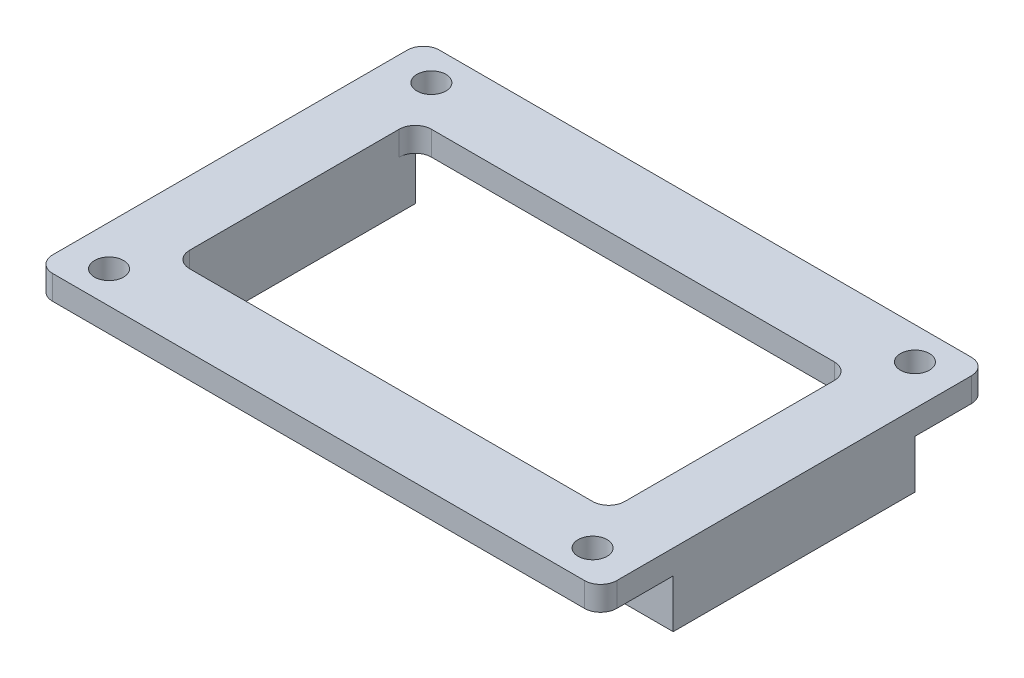
ISO-10303-21;
HEADER;
FILE_DESCRIPTION(('STEP AP214'),'2;1');
FILE_NAME('part.step','',(''),(''),'','','');
FILE_SCHEMA(('AUTOMOTIVE_DESIGN { 1 0 10303 214 1 1 1 1 }'));
ENDSEC;
DATA;
#1=APPLICATION_CONTEXT('core data for automotive mechanical design processes');
#2=APPLICATION_PROTOCOL_DEFINITION('international standard','automotive_design',2000,#1);
#3=PRODUCT_CONTEXT('',#1,'mechanical');
#4=PRODUCT('Part','Part','',(#3));
#5=PRODUCT_RELATED_PRODUCT_CATEGORY('part','',(#4));
#6=PRODUCT_DEFINITION_FORMATION('','',#4);
#7=PRODUCT_DEFINITION_CONTEXT('part definition',#1,'design');
#8=PRODUCT_DEFINITION('design','',#6,#7);
#9=PRODUCT_DEFINITION_SHAPE('','',#8);
#10=(LENGTH_UNIT() NAMED_UNIT(*) SI_UNIT(.MILLI.,.METRE.));
#11=(NAMED_UNIT(*) PLANE_ANGLE_UNIT() SI_UNIT($,.RADIAN.));
#12=(NAMED_UNIT(*) SI_UNIT($,.STERADIAN.) SOLID_ANGLE_UNIT());
#13=UNCERTAINTY_MEASURE_WITH_UNIT(LENGTH_MEASURE(1.E-05),#10,'distance_accuracy_value','');
#14=(GEOMETRIC_REPRESENTATION_CONTEXT(3) GLOBAL_UNCERTAINTY_ASSIGNED_CONTEXT((#13)) GLOBAL_UNIT_ASSIGNED_CONTEXT((#10,
#11,#12)) REPRESENTATION_CONTEXT('',''));
#15=CARTESIAN_POINT('',(0.,0.,0.));
#16=DIRECTION('',(0.,0.,1.));
#17=DIRECTION('',(1.,0.,0.));
#18=AXIS2_PLACEMENT_3D('',#15,#16,#17);
#19=CARTESIAN_POINT('',(0.,0.,0.));
#20=DIRECTION('',(0.,1.,0.));
#21=DIRECTION('',(0.,0.,1.));
#22=AXIS2_PLACEMENT_3D('',#19,#20,#21);
#23=PLANE('',#22);
#24=CARTESIAN_POINT('',(30.,0.,20.));
#25=DIRECTION('',(0.,-1.,0.));
#26=DIRECTION('',(0.,0.,-1.));
#27=AXIS2_PLACEMENT_3D('',#24,#25,#26);
#28=CIRCLE('',#27,1.8);
#29=CARTESIAN_POINT('',(30.,0.,18.2));
#30=VERTEX_POINT('',#29);
#31=EDGE_CURVE('E263',#30,#30,#28,.T.);
#32=ORIENTED_EDGE('',*,*,#31,.F.);
#33=EDGE_LOOP('',(#32));
#34=FACE_BOUND('',#33,.T.);
#35=CARTESIAN_POINT('',(-30.,0.,20.));
#36=DIRECTION('',(0.,-1.,0.));
#37=DIRECTION('',(0.,0.,-1.));
#38=AXIS2_PLACEMENT_3D('',#35,#36,#37);
#39=CIRCLE('',#38,1.8);
#40=CARTESIAN_POINT('',(-30.,0.,18.2));
#41=VERTEX_POINT('',#40);
#42=EDGE_CURVE('E240',#41,#41,#39,.T.);
#43=ORIENTED_EDGE('',*,*,#42,.F.);
#44=EDGE_LOOP('',(#43));
#45=FACE_BOUND('',#44,.T.);
#46=DIRECTION('',(0.,0.,-1.));
#47=VECTOR('',#46,1.);
#48=CARTESIAN_POINT('',(35.,0.,0.));
#49=LINE('',#48,#47);
#50=CARTESIAN_POINT('',(35.,0.,22.));
#51=VERTEX_POINT('',#50);
#52=CARTESIAN_POINT('',(35.,0.,15.));
#53=VERTEX_POINT('',#52);
#54=EDGE_CURVE('E289',#51,#53,#49,.T.);
#55=ORIENTED_EDGE('',*,*,#54,.F.);
#56=CARTESIAN_POINT('',(33.,0.,22.));
#57=DIRECTION('',(0.,1.,0.));
#58=DIRECTION('',(0.,0.,1.));
#59=AXIS2_PLACEMENT_3D('',#56,#57,#58);
#60=CIRCLE('',#59,2.);
#61=CARTESIAN_POINT('',(33.,0.,24.));
#62=VERTEX_POINT('',#61);
#63=EDGE_CURVE('E320',#51,#62,#60,.F.);
#64=ORIENTED_EDGE('',*,*,#63,.T.);
#65=DIRECTION('',(-1.,0.,0.));
#66=VECTOR('',#65,1.);
#67=CARTESIAN_POINT('',(0.,0.,24.));
#68=LINE('',#67,#66);
#69=CARTESIAN_POINT('',(-33.,0.,24.));
#70=VERTEX_POINT('',#69);
#71=EDGE_CURVE('E285',#62,#70,#68,.T.);
#72=ORIENTED_EDGE('',*,*,#71,.T.);
#73=CARTESIAN_POINT('',(-33.,0.,22.));
#74=DIRECTION('',(0.,1.,0.));
#75=DIRECTION('',(0.,0.,1.));
#76=AXIS2_PLACEMENT_3D('',#73,#74,#75);
#77=CIRCLE('',#76,2.);
#78=CARTESIAN_POINT('',(-35.,0.,22.));
#79=VERTEX_POINT('',#78);
#80=EDGE_CURVE('E318',#70,#79,#77,.F.);
#81=ORIENTED_EDGE('',*,*,#80,.T.);
#82=DIRECTION('',(0.,0.,-1.));
#83=VECTOR('',#82,1.);
#84=CARTESIAN_POINT('',(-35.,0.,0.));
#85=LINE('',#84,#83);
#86=CARTESIAN_POINT('',(-35.,0.,15.));
#87=VERTEX_POINT('',#86);
#88=EDGE_CURVE('E228',#79,#87,#85,.T.);
#89=ORIENTED_EDGE('',*,*,#88,.T.);
#90=DIRECTION('',(1.,0.,0.));
#91=VECTOR('',#90,1.);
#92=CARTESIAN_POINT('',(0.,0.,15.));
#93=LINE('',#92,#91);
#94=CARTESIAN_POINT('',(-27.,0.,15.));
#95=VERTEX_POINT('',#94);
#96=EDGE_CURVE('E225',#87,#95,#93,.T.);
#97=ORIENTED_EDGE('',*,*,#96,.T.);
#98=DIRECTION('',(0.,0.,1.));
#99=VECTOR('',#98,1.);
#100=CARTESIAN_POINT('',(-27.,0.,0.));
#101=LINE('',#100,#99);
#102=CARTESIAN_POINT('',(-27.,0.,13.));
#103=VERTEX_POINT('',#102);
#104=EDGE_CURVE('E213',#103,#95,#101,.T.);
#105=ORIENTED_EDGE('',*,*,#104,.F.);
#106=CARTESIAN_POINT('',(-25.,0.,13.));
#107=DIRECTION('',(0.,1.,0.));
#108=DIRECTION('',(0.,0.,1.));
#109=AXIS2_PLACEMENT_3D('',#106,#107,#108);
#110=CIRCLE('',#109,2.);
#111=CARTESIAN_POINT('',(-25.,0.,15.));
#112=VERTEX_POINT('',#111);
#113=EDGE_CURVE('E47',#103,#112,#110,.T.);
#114=ORIENTED_EDGE('',*,*,#113,.T.);
#115=DIRECTION('',(-1.,0.,0.));
#116=VECTOR('',#115,1.);
#117=CARTESIAN_POINT('',(-27.,0.,15.));
#118=LINE('',#117,#116);
#119=CARTESIAN_POINT('',(25.,0.,15.));
#120=VERTEX_POINT('',#119);
#121=EDGE_CURVE('E362',#120,#112,#118,.T.);
#122=ORIENTED_EDGE('',*,*,#121,.F.);
#123=CARTESIAN_POINT('',(25.,0.,13.));
#124=DIRECTION('',(0.,1.,0.));
#125=DIRECTION('',(0.,0.,1.));
#126=AXIS2_PLACEMENT_3D('',#123,#124,#125);
#127=CIRCLE('',#126,2.);
#128=CARTESIAN_POINT('',(27.,0.,13.));
#129=VERTEX_POINT('',#128);
#130=EDGE_CURVE('E349',#120,#129,#127,.T.);
#131=ORIENTED_EDGE('',*,*,#130,.T.);
#132=DIRECTION('',(0.,0.,-1.));
#133=VECTOR('',#132,1.);
#134=CARTESIAN_POINT('',(27.,0.,0.));
#135=LINE('',#134,#133);
#136=CARTESIAN_POINT('',(27.,0.,15.));
#137=VERTEX_POINT('',#136);
#138=EDGE_CURVE('E62',#137,#129,#135,.T.);
#139=ORIENTED_EDGE('',*,*,#138,.F.);
#140=DIRECTION('',(1.,0.,0.));
#141=VECTOR('',#140,1.);
#142=CARTESIAN_POINT('',(0.,0.,15.));
#143=LINE('',#142,#141);
#144=EDGE_CURVE('E417',#137,#53,#143,.T.);
#145=ORIENTED_EDGE('',*,*,#144,.T.);
#146=EDGE_LOOP('',(#55,#64,#72,#81,#89,#97,#105,#114,#122,#131,#139,#145));
#147=FACE_BOUND('',#146,.T.);
#148=ADVANCED_FACE('F39',(#34,#45,#147),#23,.F.);
#149=CARTESIAN_POINT('',(30.,0.,-20.));
#150=DIRECTION('',(0.,-1.,0.));
#151=DIRECTION('',(0.,0.,-1.));
#152=AXIS2_PLACEMENT_3D('',#149,#150,#151);
#153=CIRCLE('',#152,1.8);
#154=CARTESIAN_POINT('',(30.,0.,-21.8));
#155=VERTEX_POINT('',#154);
#156=EDGE_CURVE('E257',#155,#155,#153,.T.);
#157=ORIENTED_EDGE('',*,*,#156,.F.);
#158=EDGE_LOOP('',(#157));
#159=FACE_BOUND('',#158,.T.);
#160=CARTESIAN_POINT('',(-30.,0.,-20.));
#161=DIRECTION('',(0.,-1.,0.));
#162=DIRECTION('',(0.,0.,-1.));
#163=AXIS2_PLACEMENT_3D('',#160,#161,#162);
#164=CIRCLE('',#163,1.8);
#165=CARTESIAN_POINT('',(-30.,0.,-21.8));
#166=VERTEX_POINT('',#165);
#167=EDGE_CURVE('E251',#166,#166,#164,.T.);
#168=ORIENTED_EDGE('',*,*,#167,.F.);
#169=EDGE_LOOP('',(#168));
#170=FACE_BOUND('',#169,.T.);
#171=DIRECTION('',(-1.,0.,0.));
#172=VECTOR('',#171,1.);
#173=CARTESIAN_POINT('',(0.,0.,-24.));
#174=LINE('',#173,#172);
#175=CARTESIAN_POINT('',(33.,0.,-24.));
#176=VERTEX_POINT('',#175);
#177=CARTESIAN_POINT('',(-33.,0.,-24.));
#178=VERTEX_POINT('',#177);
#179=EDGE_CURVE('E274',#176,#178,#174,.T.);
#180=ORIENTED_EDGE('',*,*,#179,.F.);
#181=CARTESIAN_POINT('',(33.,0.,-22.));
#182=DIRECTION('',(0.,1.,0.));
#183=DIRECTION('',(0.,0.,1.));
#184=AXIS2_PLACEMENT_3D('',#181,#182,#183);
#185=CIRCLE('',#184,2.);
#186=CARTESIAN_POINT('',(35.,0.,-22.));
#187=VERTEX_POINT('',#186);
#188=EDGE_CURVE('E342',#176,#187,#185,.F.);
#189=ORIENTED_EDGE('',*,*,#188,.T.);
#190=CARTESIAN_POINT('',(35.,0.,-15.));
#191=VERTEX_POINT('',#190);
#192=EDGE_CURVE('E288',#191,#187,#49,.T.);
#193=ORIENTED_EDGE('',*,*,#192,.F.);
#194=DIRECTION('',(1.,0.,0.));
#195=VECTOR('',#194,1.);
#196=CARTESIAN_POINT('',(0.,0.,-15.));
#197=LINE('',#196,#195);
#198=CARTESIAN_POINT('',(27.,0.,-15.));
#199=VERTEX_POINT('',#198);
#200=EDGE_CURVE('E422',#199,#191,#197,.T.);
#201=ORIENTED_EDGE('',*,*,#200,.F.);
#202=DIRECTION('',(0.,0.,-1.));
#203=VECTOR('',#202,1.);
#204=CARTESIAN_POINT('',(27.,0.,0.));
#205=LINE('',#204,#203);
#206=CARTESIAN_POINT('',(27.,0.,-13.));
#207=VERTEX_POINT('',#206);
#208=EDGE_CURVE('E297',#207,#199,#205,.T.);
#209=ORIENTED_EDGE('',*,*,#208,.F.);
#210=CARTESIAN_POINT('',(25.,0.,-13.));
#211=DIRECTION('',(0.,1.,0.));
#212=DIRECTION('',(0.,0.,1.));
#213=AXIS2_PLACEMENT_3D('',#210,#211,#212);
#214=CIRCLE('',#213,2.);
#215=CARTESIAN_POINT('',(25.,0.,-15.));
#216=VERTEX_POINT('',#215);
#217=EDGE_CURVE('E353',#207,#216,#214,.T.);
#218=ORIENTED_EDGE('',*,*,#217,.T.);
#219=DIRECTION('',(1.,0.,0.));
#220=VECTOR('',#219,1.);
#221=CARTESIAN_POINT('',(-27.,0.,-15.));
#222=LINE('',#221,#220);
#223=CARTESIAN_POINT('',(-25.,0.,-15.));
#224=VERTEX_POINT('',#223);
#225=EDGE_CURVE('E371',#224,#216,#222,.T.);
#226=ORIENTED_EDGE('',*,*,#225,.F.);
#227=CARTESIAN_POINT('',(-25.,0.,-13.));
#228=DIRECTION('',(0.,1.,0.));
#229=DIRECTION('',(0.,0.,1.));
#230=AXIS2_PLACEMENT_3D('',#227,#228,#229);
#231=CIRCLE('',#230,2.);
#232=CARTESIAN_POINT('',(-27.,0.,-13.));
#233=VERTEX_POINT('',#232);
#234=EDGE_CURVE('E357',#224,#233,#231,.T.);
#235=ORIENTED_EDGE('',*,*,#234,.T.);
#236=DIRECTION('',(0.,0.,1.));
#237=VECTOR('',#236,1.);
#238=CARTESIAN_POINT('',(-27.,0.,0.));
#239=LINE('',#238,#237);
#240=CARTESIAN_POINT('',(-27.,0.,-15.));
#241=VERTEX_POINT('',#240);
#242=EDGE_CURVE('E54',#241,#233,#239,.T.);
#243=ORIENTED_EDGE('',*,*,#242,.F.);
#244=DIRECTION('',(1.,0.,0.));
#245=VECTOR('',#244,1.);
#246=CARTESIAN_POINT('',(0.,0.,-15.));
#247=LINE('',#246,#245);
#248=CARTESIAN_POINT('',(-35.,0.,-15.));
#249=VERTEX_POINT('',#248);
#250=EDGE_CURVE('E232',#249,#241,#247,.T.);
#251=ORIENTED_EDGE('',*,*,#250,.F.);
#252=CARTESIAN_POINT('',(-35.,0.,-22.));
#253=VERTEX_POINT('',#252);
#254=EDGE_CURVE('E269',#249,#253,#85,.T.);
#255=ORIENTED_EDGE('',*,*,#254,.T.);
#256=CARTESIAN_POINT('',(-33.,0.,-22.));
#257=DIRECTION('',(0.,1.,0.));
#258=DIRECTION('',(0.,0.,1.));
#259=AXIS2_PLACEMENT_3D('',#256,#257,#258);
#260=CIRCLE('',#259,2.);
#261=EDGE_CURVE('E340',#253,#178,#260,.F.);
#262=ORIENTED_EDGE('',*,*,#261,.T.);
#263=EDGE_LOOP('',(#180,#189,#193,#201,#209,#218,#226,#235,#243,#251,#255,#262));
#264=FACE_BOUND('',#263,.T.);
#265=ADVANCED_FACE('F463',(#159,#170,#264),#23,.F.);
#266=CARTESIAN_POINT('',(-35.,3.,0.));
#267=DIRECTION('',(-1.,0.,0.));
#268=DIRECTION('',(0.,0.,1.));
#269=AXIS2_PLACEMENT_3D('',#266,#267,#268);
#270=PLANE('',#269);
#271=DIRECTION('',(0.,0.,-1.));
#272=VECTOR('',#271,1.);
#273=CARTESIAN_POINT('',(-35.,3.,0.));
#274=LINE('',#273,#272);
#275=CARTESIAN_POINT('',(-35.,3.,22.));
#276=VERTEX_POINT('',#275);
#277=CARTESIAN_POINT('',(-35.,3.,-22.));
#278=VERTEX_POINT('',#277);
#279=EDGE_CURVE('E270',#276,#278,#274,.T.);
#280=ORIENTED_EDGE('',*,*,#279,.T.);
#281=DIRECTION('',(0.,-1.,0.));
#282=VECTOR('',#281,1.);
#283=CARTESIAN_POINT('',(-35.,0.,-22.));
#284=LINE('',#283,#282);
#285=EDGE_CURVE('E346',#278,#253,#284,.T.);
#286=ORIENTED_EDGE('',*,*,#285,.T.);
#287=ORIENTED_EDGE('',*,*,#254,.F.);
#288=DIRECTION('',(0.,1.,0.));
#289=VECTOR('',#288,1.);
#290=CARTESIAN_POINT('',(-35.,-6.,-15.));
#291=LINE('',#290,#289);
#292=CARTESIAN_POINT('',(-35.,-6.,-15.));
#293=VERTEX_POINT('',#292);
#294=EDGE_CURVE('E242',#293,#249,#291,.T.);
#295=ORIENTED_EDGE('',*,*,#294,.F.);
#296=DIRECTION('',(0.,0.,-1.));
#297=VECTOR('',#296,1.);
#298=CARTESIAN_POINT('',(-35.,-6.,0.));
#299=LINE('',#298,#297);
#300=CARTESIAN_POINT('',(-35.,-6.,15.));
#301=VERTEX_POINT('',#300);
#302=EDGE_CURVE('E447',#301,#293,#299,.T.);
#303=ORIENTED_EDGE('',*,*,#302,.F.);
#304=DIRECTION('',(0.,1.,0.));
#305=VECTOR('',#304,1.);
#306=CARTESIAN_POINT('',(-35.,-6.,15.));
#307=LINE('',#306,#305);
#308=EDGE_CURVE('E238',#301,#87,#307,.T.);
#309=ORIENTED_EDGE('',*,*,#308,.T.);
#310=ORIENTED_EDGE('',*,*,#88,.F.);
#311=DIRECTION('',(0.,-1.,0.));
#312=VECTOR('',#311,1.);
#313=CARTESIAN_POINT('',(-35.,3.,22.));
#314=LINE('',#313,#312);
#315=EDGE_CURVE('E344',#79,#276,#314,.F.);
#316=ORIENTED_EDGE('',*,*,#315,.T.);
#317=EDGE_LOOP('',(#280,#286,#287,#295,#303,#309,#310,#316));
#318=FACE_BOUND('',#317,.T.);
#319=ADVANCED_FACE('F459',(#318),#270,.T.);
#320=CARTESIAN_POINT('',(0.,3.,24.));
#321=DIRECTION('',(0.,0.,1.));
#322=DIRECTION('',(1.,0.,0.));
#323=AXIS2_PLACEMENT_3D('',#320,#321,#322);
#324=PLANE('',#323);
#325=ORIENTED_EDGE('',*,*,#71,.F.);
#326=DIRECTION('',(0.,-1.,0.));
#327=VECTOR('',#326,1.);
#328=CARTESIAN_POINT('',(33.,3.,24.));
#329=LINE('',#328,#327);
#330=CARTESIAN_POINT('',(33.,3.,24.));
#331=VERTEX_POINT('',#330);
#332=EDGE_CURVE('E325',#62,#331,#329,.F.);
#333=ORIENTED_EDGE('',*,*,#332,.T.);
#334=DIRECTION('',(-1.,0.,0.));
#335=VECTOR('',#334,1.);
#336=CARTESIAN_POINT('',(0.,3.,24.));
#337=LINE('',#336,#335);
#338=CARTESIAN_POINT('',(-33.,3.,24.));
#339=VERTEX_POINT('',#338);
#340=EDGE_CURVE('E273',#331,#339,#337,.T.);
#341=ORIENTED_EDGE('',*,*,#340,.T.);
#342=DIRECTION('',(0.,-1.,0.));
#343=VECTOR('',#342,1.);
#344=CARTESIAN_POINT('',(-33.,3.,24.));
#345=LINE('',#344,#343);
#346=EDGE_CURVE('E322',#339,#70,#345,.T.);
#347=ORIENTED_EDGE('',*,*,#346,.T.);
#348=EDGE_LOOP('',(#325,#333,#341,#347));
#349=FACE_BOUND('',#348,.T.);
#350=ADVANCED_FACE('F482',(#349),#324,.T.);
#351=CARTESIAN_POINT('',(35.,3.,0.));
#352=DIRECTION('',(-1.,0.,0.));
#353=DIRECTION('',(0.,0.,1.));
#354=AXIS2_PLACEMENT_3D('',#351,#352,#353);
#355=PLANE('',#354);
#356=DIRECTION('',(0.,0.,-1.));
#357=VECTOR('',#356,1.);
#358=CARTESIAN_POINT('',(35.,3.,0.));
#359=LINE('',#358,#357);
#360=CARTESIAN_POINT('',(35.,3.,22.));
#361=VERTEX_POINT('',#360);
#362=CARTESIAN_POINT('',(35.,3.,-22.));
#363=VERTEX_POINT('',#362);
#364=EDGE_CURVE('E277',#361,#363,#359,.T.);
#365=ORIENTED_EDGE('',*,*,#364,.F.);
#366=DIRECTION('',(0.,-1.,0.));
#367=VECTOR('',#366,1.);
#368=CARTESIAN_POINT('',(35.,0.,22.));
#369=LINE('',#368,#367);
#370=EDGE_CURVE('E315',#361,#51,#369,.T.);
#371=ORIENTED_EDGE('',*,*,#370,.T.);
#372=ORIENTED_EDGE('',*,*,#54,.T.);
#373=DIRECTION('',(0.,1.,0.));
#374=VECTOR('',#373,1.);
#375=CARTESIAN_POINT('',(35.,-6.,15.));
#376=LINE('',#375,#374);
#377=CARTESIAN_POINT('',(35.,-6.,15.));
#378=VERTEX_POINT('',#377);
#379=EDGE_CURVE('E429',#378,#53,#376,.T.);
#380=ORIENTED_EDGE('',*,*,#379,.F.);
#381=DIRECTION('',(0.,0.,1.));
#382=VECTOR('',#381,1.);
#383=CARTESIAN_POINT('',(35.,-6.,0.));
#384=LINE('',#383,#382);
#385=CARTESIAN_POINT('',(35.,-6.,-15.));
#386=VERTEX_POINT('',#385);
#387=EDGE_CURVE('E427',#386,#378,#384,.T.);
#388=ORIENTED_EDGE('',*,*,#387,.F.);
#389=DIRECTION('',(0.,1.,0.));
#390=VECTOR('',#389,1.);
#391=CARTESIAN_POINT('',(35.,-6.,-15.));
#392=LINE('',#391,#390);
#393=EDGE_CURVE('E435',#386,#191,#392,.T.);
#394=ORIENTED_EDGE('',*,*,#393,.T.);
#395=ORIENTED_EDGE('',*,*,#192,.T.);
#396=DIRECTION('',(0.,-1.,0.));
#397=VECTOR('',#396,1.);
#398=CARTESIAN_POINT('',(35.,3.,-22.));
#399=LINE('',#398,#397);
#400=EDGE_CURVE('E313',#187,#363,#399,.F.);
#401=ORIENTED_EDGE('',*,*,#400,.T.);
#402=EDGE_LOOP('',(#365,#371,#372,#380,#388,#394,#395,#401));
#403=FACE_BOUND('',#402,.T.);
#404=ADVANCED_FACE('F490',(#403),#355,.F.);
#405=CARTESIAN_POINT('',(0.,3.,-24.));
#406=DIRECTION('',(0.,0.,1.));
#407=DIRECTION('',(1.,0.,0.));
#408=AXIS2_PLACEMENT_3D('',#405,#406,#407);
#409=PLANE('',#408);
#410=DIRECTION('',(-1.,0.,0.));
#411=VECTOR('',#410,1.);
#412=CARTESIAN_POINT('',(0.,3.,-24.));
#413=LINE('',#412,#411);
#414=CARTESIAN_POINT('',(33.,3.,-24.));
#415=VERTEX_POINT('',#414);
#416=CARTESIAN_POINT('',(-33.,3.,-24.));
#417=VERTEX_POINT('',#416);
#418=EDGE_CURVE('E280',#415,#417,#413,.T.);
#419=ORIENTED_EDGE('',*,*,#418,.F.);
#420=DIRECTION('',(0.,-1.,0.));
#421=VECTOR('',#420,1.);
#422=CARTESIAN_POINT('',(33.,3.,-24.));
#423=LINE('',#422,#421);
#424=EDGE_CURVE('E337',#415,#176,#423,.T.);
#425=ORIENTED_EDGE('',*,*,#424,.T.);
#426=ORIENTED_EDGE('',*,*,#179,.T.);
#427=DIRECTION('',(0.,-1.,0.));
#428=VECTOR('',#427,1.);
#429=CARTESIAN_POINT('',(-33.,3.,-24.));
#430=LINE('',#429,#428);
#431=EDGE_CURVE('E335',#178,#417,#430,.F.);
#432=ORIENTED_EDGE('',*,*,#431,.T.);
#433=EDGE_LOOP('',(#419,#425,#426,#432));
#434=FACE_BOUND('',#433,.T.);
#435=ADVANCED_FACE('F468',(#434),#409,.F.);
#436=CARTESIAN_POINT('',(0.,3.,0.));
#437=DIRECTION('',(0.,1.,0.));
#438=DIRECTION('',(0.,0.,1.));
#439=AXIS2_PLACEMENT_3D('',#436,#437,#438);
#440=PLANE('',#439);
#441=DIRECTION('',(-1.,0.,0.));
#442=VECTOR('',#441,1.);
#443=CARTESIAN_POINT('',(-27.,3.,15.));
#444=LINE('',#443,#442);
#445=CARTESIAN_POINT('',(25.,3.,15.));
#446=VERTEX_POINT('',#445);
#447=CARTESIAN_POINT('',(-25.,3.,15.));
#448=VERTEX_POINT('',#447);
#449=EDGE_CURVE('E380',#446,#448,#444,.T.);
#450=ORIENTED_EDGE('',*,*,#449,.T.);
#451=CARTESIAN_POINT('',(-25.,3.,13.));
#452=DIRECTION('',(0.,1.,0.));
#453=DIRECTION('',(0.,0.,1.));
#454=AXIS2_PLACEMENT_3D('',#451,#452,#453);
#455=CIRCLE('',#454,2.);
#456=CARTESIAN_POINT('',(-27.,3.,13.));
#457=VERTEX_POINT('',#456);
#458=EDGE_CURVE('E11',#448,#457,#455,.F.);
#459=ORIENTED_EDGE('',*,*,#458,.T.);
#460=DIRECTION('',(0.,0.,-1.));
#461=VECTOR('',#460,1.);
#462=CARTESIAN_POINT('',(-27.,3.,15.));
#463=LINE('',#462,#461);
#464=CARTESIAN_POINT('',(-27.,3.,-13.));
#465=VERTEX_POINT('',#464);
#466=EDGE_CURVE('E370',#457,#465,#463,.T.);
#467=ORIENTED_EDGE('',*,*,#466,.T.);
#468=CARTESIAN_POINT('',(-25.,3.,-13.));
#469=DIRECTION('',(0.,1.,0.));
#470=DIRECTION('',(0.,0.,1.));
#471=AXIS2_PLACEMENT_3D('',#468,#469,#470);
#472=CIRCLE('',#471,2.);
#473=CARTESIAN_POINT('',(-25.,3.,-15.));
#474=VERTEX_POINT('',#473);
#475=EDGE_CURVE('E359',#465,#474,#472,.F.);
#476=ORIENTED_EDGE('',*,*,#475,.T.);
#477=DIRECTION('',(1.,0.,0.));
#478=VECTOR('',#477,1.);
#479=CARTESIAN_POINT('',(-27.,3.,-15.));
#480=LINE('',#479,#478);
#481=CARTESIAN_POINT('',(25.,3.,-15.));
#482=VERTEX_POINT('',#481);
#483=EDGE_CURVE('E382',#474,#482,#480,.T.);
#484=ORIENTED_EDGE('',*,*,#483,.T.);
#485=CARTESIAN_POINT('',(25.,3.,-13.));
#486=DIRECTION('',(0.,1.,0.));
#487=DIRECTION('',(0.,0.,1.));
#488=AXIS2_PLACEMENT_3D('',#485,#486,#487);
#489=CIRCLE('',#488,2.);
#490=CARTESIAN_POINT('',(27.,3.,-13.));
#491=VERTEX_POINT('',#490);
#492=EDGE_CURVE('E355',#482,#491,#489,.F.);
#493=ORIENTED_EDGE('',*,*,#492,.T.);
#494=DIRECTION('',(0.,0.,1.));
#495=VECTOR('',#494,1.);
#496=CARTESIAN_POINT('',(27.,3.,15.));
#497=LINE('',#496,#495);
#498=CARTESIAN_POINT('',(27.,3.,13.));
#499=VERTEX_POINT('',#498);
#500=EDGE_CURVE('E385',#491,#499,#497,.T.);
#501=ORIENTED_EDGE('',*,*,#500,.T.);
#502=CARTESIAN_POINT('',(25.,3.,13.));
#503=DIRECTION('',(0.,1.,0.));
#504=DIRECTION('',(0.,0.,1.));
#505=AXIS2_PLACEMENT_3D('',#502,#503,#504);
#506=CIRCLE('',#505,2.);
#507=EDGE_CURVE('E351',#499,#446,#506,.F.);
#508=ORIENTED_EDGE('',*,*,#507,.T.);
#509=EDGE_LOOP('',(#450,#459,#467,#476,#484,#493,#501,#508));
#510=FACE_BOUND('',#509,.T.);
#511=CARTESIAN_POINT('',(-30.,3.,20.));
#512=DIRECTION('',(0.,1.,0.));
#513=DIRECTION('',(0.,0.,1.));
#514=AXIS2_PLACEMENT_3D('',#511,#512,#513);
#515=CIRCLE('',#514,1.8);
#516=CARTESIAN_POINT('',(-30.,3.,21.8));
#517=VERTEX_POINT('',#516);
#518=EDGE_CURVE('E248',#517,#517,#515,.T.);
#519=ORIENTED_EDGE('',*,*,#518,.F.);
#520=EDGE_LOOP('',(#519));
#521=FACE_BOUND('',#520,.T.);
#522=CARTESIAN_POINT('',(-30.,3.,-20.));
#523=DIRECTION('',(0.,1.,0.));
#524=DIRECTION('',(0.,0.,1.));
#525=AXIS2_PLACEMENT_3D('',#522,#523,#524);
#526=CIRCLE('',#525,1.8);
#527=CARTESIAN_POINT('',(-30.,3.,-18.2));
#528=VERTEX_POINT('',#527);
#529=EDGE_CURVE('E254',#528,#528,#526,.T.);
#530=ORIENTED_EDGE('',*,*,#529,.F.);
#531=EDGE_LOOP('',(#530));
#532=FACE_BOUND('',#531,.T.);
#533=CARTESIAN_POINT('',(30.,3.,-20.));
#534=DIRECTION('',(0.,1.,0.));
#535=DIRECTION('',(0.,0.,1.));
#536=AXIS2_PLACEMENT_3D('',#533,#534,#535);
#537=CIRCLE('',#536,1.8);
#538=CARTESIAN_POINT('',(30.,3.,-18.2));
#539=VERTEX_POINT('',#538);
#540=EDGE_CURVE('E260',#539,#539,#537,.T.);
#541=ORIENTED_EDGE('',*,*,#540,.F.);
#542=EDGE_LOOP('',(#541));
#543=FACE_BOUND('',#542,.T.);
#544=CARTESIAN_POINT('',(30.,3.,20.));
#545=DIRECTION('',(0.,1.,0.));
#546=DIRECTION('',(0.,0.,1.));
#547=AXIS2_PLACEMENT_3D('',#544,#545,#546);
#548=CIRCLE('',#547,1.8);
#549=CARTESIAN_POINT('',(30.,3.,21.8));
#550=VERTEX_POINT('',#549);
#551=EDGE_CURVE('E266',#550,#550,#548,.T.);
#552=ORIENTED_EDGE('',*,*,#551,.F.);
#553=EDGE_LOOP('',(#552));
#554=FACE_BOUND('',#553,.T.);
#555=ORIENTED_EDGE('',*,*,#340,.F.);
#556=CARTESIAN_POINT('',(33.,3.,22.));
#557=DIRECTION('',(0.,1.,0.));
#558=DIRECTION('',(0.,0.,1.));
#559=AXIS2_PLACEMENT_3D('',#556,#557,#558);
#560=CIRCLE('',#559,2.);
#561=EDGE_CURVE('E333',#331,#361,#560,.T.);
#562=ORIENTED_EDGE('',*,*,#561,.T.);
#563=ORIENTED_EDGE('',*,*,#364,.T.);
#564=CARTESIAN_POINT('',(33.,3.,-22.));
#565=DIRECTION('',(0.,1.,0.));
#566=DIRECTION('',(0.,0.,1.));
#567=AXIS2_PLACEMENT_3D('',#564,#565,#566);
#568=CIRCLE('',#567,2.);
#569=EDGE_CURVE('E331',#363,#415,#568,.T.);
#570=ORIENTED_EDGE('',*,*,#569,.T.);
#571=ORIENTED_EDGE('',*,*,#418,.T.);
#572=CARTESIAN_POINT('',(-33.,3.,-22.));
#573=DIRECTION('',(0.,1.,0.));
#574=DIRECTION('',(0.,0.,1.));
#575=AXIS2_PLACEMENT_3D('',#572,#573,#574);
#576=CIRCLE('',#575,2.);
#577=EDGE_CURVE('E329',#417,#278,#576,.T.);
#578=ORIENTED_EDGE('',*,*,#577,.T.);
#579=ORIENTED_EDGE('',*,*,#279,.F.);
#580=CARTESIAN_POINT('',(-33.,3.,22.));
#581=DIRECTION('',(0.,1.,0.));
#582=DIRECTION('',(0.,0.,1.));
#583=AXIS2_PLACEMENT_3D('',#580,#581,#582);
#584=CIRCLE('',#583,2.);
#585=EDGE_CURVE('E327',#276,#339,#584,.T.);
#586=ORIENTED_EDGE('',*,*,#585,.T.);
#587=EDGE_LOOP('',(#555,#562,#563,#570,#571,#578,#579,#586));
#588=FACE_BOUND('',#587,.T.);
#589=ADVANCED_FACE('F377',(#510,#521,#532,#543,#554,#588),#440,.T.);
#590=CARTESIAN_POINT('',(30.,0.,20.));
#591=DIRECTION('',(0.,-1.,0.));
#592=DIRECTION('',(0.,0.,-1.));
#593=AXIS2_PLACEMENT_3D('',#590,#591,#592);
#594=CYLINDRICAL_SURFACE('',#593,1.8);
#595=ORIENTED_EDGE('',*,*,#551,.T.);
#596=EDGE_LOOP('',(#595));
#597=FACE_BOUND('',#596,.T.);
#598=ORIENTED_EDGE('',*,*,#31,.T.);
#599=EDGE_LOOP('',(#598));
#600=FACE_BOUND('',#599,.T.);
#601=ADVANCED_FACE('F821',(#597,#600),#594,.F.);
#602=CARTESIAN_POINT('',(30.,0.,-20.));
#603=DIRECTION('',(0.,-1.,0.));
#604=DIRECTION('',(0.,0.,-1.));
#605=AXIS2_PLACEMENT_3D('',#602,#603,#604);
#606=CYLINDRICAL_SURFACE('',#605,1.8);
#607=ORIENTED_EDGE('',*,*,#540,.T.);
#608=EDGE_LOOP('',(#607));
#609=FACE_BOUND('',#608,.T.);
#610=ORIENTED_EDGE('',*,*,#156,.T.);
#611=EDGE_LOOP('',(#610));
#612=FACE_BOUND('',#611,.T.);
#613=ADVANCED_FACE('F811',(#609,#612),#606,.F.);
#614=CARTESIAN_POINT('',(-30.,0.,-20.));
#615=DIRECTION('',(0.,-1.,0.));
#616=DIRECTION('',(0.,0.,-1.));
#617=AXIS2_PLACEMENT_3D('',#614,#615,#616);
#618=CYLINDRICAL_SURFACE('',#617,1.8);
#619=ORIENTED_EDGE('',*,*,#529,.T.);
#620=EDGE_LOOP('',(#619));
#621=FACE_BOUND('',#620,.T.);
#622=ORIENTED_EDGE('',*,*,#167,.T.);
#623=EDGE_LOOP('',(#622));
#624=FACE_BOUND('',#623,.T.);
#625=ADVANCED_FACE('F801',(#621,#624),#618,.F.);
#626=CARTESIAN_POINT('',(-30.,0.,20.));
#627=DIRECTION('',(0.,-1.,0.));
#628=DIRECTION('',(0.,0.,-1.));
#629=AXIS2_PLACEMENT_3D('',#626,#627,#628);
#630=CYLINDRICAL_SURFACE('',#629,1.8);
#631=ORIENTED_EDGE('',*,*,#518,.T.);
#632=EDGE_LOOP('',(#631));
#633=FACE_BOUND('',#632,.T.);
#634=ORIENTED_EDGE('',*,*,#42,.T.);
#635=EDGE_LOOP('',(#634));
#636=FACE_BOUND('',#635,.T.);
#637=ADVANCED_FACE('F791',(#633,#636),#630,.F.);
#638=CARTESIAN_POINT('',(0.,-6.,-15.));
#639=DIRECTION('',(0.,0.,1.));
#640=DIRECTION('',(1.,0.,0.));
#641=AXIS2_PLACEMENT_3D('',#638,#639,#640);
#642=PLANE('',#641);
#643=ORIENTED_EDGE('',*,*,#250,.T.);
#644=DIRECTION('',(0.,1.,0.));
#645=VECTOR('',#644,1.);
#646=CARTESIAN_POINT('',(-27.,-6.,-15.));
#647=LINE('',#646,#645);
#648=CARTESIAN_POINT('',(-27.,-6.,-15.));
#649=VERTEX_POINT('',#648);
#650=EDGE_CURVE('E237',#649,#241,#647,.T.);
#651=ORIENTED_EDGE('',*,*,#650,.F.);
#652=DIRECTION('',(1.,0.,0.));
#653=VECTOR('',#652,1.);
#654=CARTESIAN_POINT('',(0.,-6.,-15.));
#655=LINE('',#654,#653);
#656=EDGE_CURVE('E231',#293,#649,#655,.T.);
#657=ORIENTED_EDGE('',*,*,#656,.F.);
#658=ORIENTED_EDGE('',*,*,#294,.T.);
#659=EDGE_LOOP('',(#643,#651,#657,#658));
#660=FACE_BOUND('',#659,.T.);
#661=ADVANCED_FACE('F454',(#660),#642,.F.);
#662=CARTESIAN_POINT('',(-27.,-6.,0.));
#663=DIRECTION('',(-1.,0.,0.));
#664=DIRECTION('',(0.,0.,1.));
#665=AXIS2_PLACEMENT_3D('',#662,#663,#664);
#666=PLANE('',#665);
#667=ORIENTED_EDGE('',*,*,#650,.T.);
#668=ORIENTED_EDGE('',*,*,#242,.T.);
#669=DIRECTION('',(0.,-1.,0.));
#670=VECTOR('',#669,1.);
#671=CARTESIAN_POINT('',(-27.,3.,-13.));
#672=LINE('',#671,#670);
#673=EDGE_CURVE('E310',#233,#465,#672,.F.);
#674=ORIENTED_EDGE('',*,*,#673,.T.);
#675=ORIENTED_EDGE('',*,*,#466,.F.);
#676=DIRECTION('',(0.,-1.,0.));
#677=VECTOR('',#676,1.);
#678=CARTESIAN_POINT('',(-27.,0.,13.));
#679=LINE('',#678,#677);
#680=EDGE_CURVE('E221',#457,#103,#679,.T.);
#681=ORIENTED_EDGE('',*,*,#680,.T.);
#682=ORIENTED_EDGE('',*,*,#104,.T.);
#683=DIRECTION('',(0.,1.,0.));
#684=VECTOR('',#683,1.);
#685=CARTESIAN_POINT('',(-27.,-6.,15.));
#686=LINE('',#685,#684);
#687=CARTESIAN_POINT('',(-27.,-6.,15.));
#688=VERTEX_POINT('',#687);
#689=EDGE_CURVE('E217',#688,#95,#686,.T.);
#690=ORIENTED_EDGE('',*,*,#689,.F.);
#691=DIRECTION('',(0.,0.,1.));
#692=VECTOR('',#691,1.);
#693=CARTESIAN_POINT('',(-27.,-6.,0.));
#694=LINE('',#693,#692);
#695=EDGE_CURVE('E444',#649,#688,#694,.T.);
#696=ORIENTED_EDGE('',*,*,#695,.F.);
#697=EDGE_LOOP('',(#667,#668,#674,#675,#681,#682,#690,#696));
#698=FACE_BOUND('',#697,.T.);
#699=ADVANCED_FACE('F215',(#698),#666,.F.);
#700=CARTESIAN_POINT('',(0.,-6.,15.));
#701=DIRECTION('',(0.,0.,1.));
#702=DIRECTION('',(1.,0.,0.));
#703=AXIS2_PLACEMENT_3D('',#700,#701,#702);
#704=PLANE('',#703);
#705=ORIENTED_EDGE('',*,*,#96,.F.);
#706=ORIENTED_EDGE('',*,*,#308,.F.);
#707=DIRECTION('',(1.,0.,0.));
#708=VECTOR('',#707,1.);
#709=CARTESIAN_POINT('',(0.,-6.,15.));
#710=LINE('',#709,#708);
#711=EDGE_CURVE('E236',#301,#688,#710,.T.);
#712=ORIENTED_EDGE('',*,*,#711,.T.);
#713=ORIENTED_EDGE('',*,*,#689,.T.);
#714=EDGE_LOOP('',(#705,#706,#712,#713));
#715=FACE_BOUND('',#714,.T.);
#716=ADVANCED_FACE('F234',(#715),#704,.T.);
#717=CARTESIAN_POINT('',(0.,-6.,0.));
#718=DIRECTION('',(0.,-1.,0.));
#719=DIRECTION('',(0.,0.,-1.));
#720=AXIS2_PLACEMENT_3D('',#717,#718,#719);
#721=PLANE('',#720);
#722=CARTESIAN_POINT('',(-32.5,-6.,12.5));
#723=DIRECTION('',(0.,-1.,0.));
#724=DIRECTION('',(0.,0.,-1.));
#725=AXIS2_PLACEMENT_3D('',#722,#723,#724);
#726=CIRCLE('',#725,1.8);
#727=CARTESIAN_POINT('',(-32.5,-6.,10.7));
#728=VERTEX_POINT('',#727);
#729=EDGE_CURVE('E391',#728,#728,#726,.T.);
#730=ORIENTED_EDGE('',*,*,#729,.F.);
#731=EDGE_LOOP('',(#730));
#732=FACE_BOUND('',#731,.T.);
#733=CARTESIAN_POINT('',(-32.5,-6.,-12.5));
#734=DIRECTION('',(0.,-1.,0.));
#735=DIRECTION('',(0.,0.,-1.));
#736=AXIS2_PLACEMENT_3D('',#733,#734,#735);
#737=CIRCLE('',#736,1.8);
#738=CARTESIAN_POINT('',(-32.5,-6.,-14.3));
#739=VERTEX_POINT('',#738);
#740=EDGE_CURVE('E411',#739,#739,#737,.T.);
#741=ORIENTED_EDGE('',*,*,#740,.F.);
#742=EDGE_LOOP('',(#741));
#743=FACE_BOUND('',#742,.T.);
#744=ORIENTED_EDGE('',*,*,#656,.T.);
#745=ORIENTED_EDGE('',*,*,#695,.T.);
#746=ORIENTED_EDGE('',*,*,#711,.F.);
#747=ORIENTED_EDGE('',*,*,#302,.T.);
#748=EDGE_LOOP('',(#744,#745,#746,#747));
#749=FACE_BOUND('',#748,.T.);
#750=ADVANCED_FACE('F520',(#732,#743,#749),#721,.T.);
#751=CARTESIAN_POINT('',(0.,-6.,15.));
#752=DIRECTION('',(0.,0.,1.));
#753=DIRECTION('',(1.,0.,0.));
#754=AXIS2_PLACEMENT_3D('',#751,#752,#753);
#755=PLANE('',#754);
#756=ORIENTED_EDGE('',*,*,#144,.F.);
#757=DIRECTION('',(0.,1.,0.));
#758=VECTOR('',#757,1.);
#759=CARTESIAN_POINT('',(27.,-6.,15.));
#760=LINE('',#759,#758);
#761=CARTESIAN_POINT('',(27.,-6.,15.));
#762=VERTEX_POINT('',#761);
#763=EDGE_CURVE('E440',#762,#137,#760,.T.);
#764=ORIENTED_EDGE('',*,*,#763,.F.);
#765=DIRECTION('',(1.,0.,0.));
#766=VECTOR('',#765,1.);
#767=CARTESIAN_POINT('',(0.,-6.,15.));
#768=LINE('',#767,#766);
#769=EDGE_CURVE('E418',#762,#378,#768,.T.);
#770=ORIENTED_EDGE('',*,*,#769,.T.);
#771=ORIENTED_EDGE('',*,*,#379,.T.);
#772=EDGE_LOOP('',(#756,#764,#770,#771));
#773=FACE_BOUND('',#772,.T.);
#774=ADVANCED_FACE('F522',(#773),#755,.T.);
#775=CARTESIAN_POINT('',(27.,-6.,0.));
#776=DIRECTION('',(-1.,0.,0.));
#777=DIRECTION('',(0.,0.,1.));
#778=AXIS2_PLACEMENT_3D('',#775,#776,#777);
#779=PLANE('',#778);
#780=ORIENTED_EDGE('',*,*,#763,.T.);
#781=ORIENTED_EDGE('',*,*,#138,.T.);
#782=DIRECTION('',(0.,-1.,0.));
#783=VECTOR('',#782,1.);
#784=CARTESIAN_POINT('',(27.,-6.,13.));
#785=LINE('',#784,#783);
#786=EDGE_CURVE('E302',#129,#499,#785,.F.);
#787=ORIENTED_EDGE('',*,*,#786,.T.);
#788=ORIENTED_EDGE('',*,*,#500,.F.);
#789=DIRECTION('',(0.,-1.,0.));
#790=VECTOR('',#789,1.);
#791=CARTESIAN_POINT('',(27.,-6.,-13.));
#792=LINE('',#791,#790);
#793=EDGE_CURVE('E299',#491,#207,#792,.T.);
#794=ORIENTED_EDGE('',*,*,#793,.T.);
#795=ORIENTED_EDGE('',*,*,#208,.T.);
#796=DIRECTION('',(0.,1.,0.));
#797=VECTOR('',#796,1.);
#798=CARTESIAN_POINT('',(27.,-6.,-15.));
#799=LINE('',#798,#797);
#800=CARTESIAN_POINT('',(27.,-6.,-15.));
#801=VERTEX_POINT('',#800);
#802=EDGE_CURVE('E437',#801,#199,#799,.T.);
#803=ORIENTED_EDGE('',*,*,#802,.F.);
#804=DIRECTION('',(0.,0.,1.));
#805=VECTOR('',#804,1.);
#806=CARTESIAN_POINT('',(27.,-6.,0.));
#807=LINE('',#806,#805);
#808=EDGE_CURVE('E421',#801,#762,#807,.T.);
#809=ORIENTED_EDGE('',*,*,#808,.T.);
#810=EDGE_LOOP('',(#780,#781,#787,#788,#794,#795,#803,#809));
#811=FACE_BOUND('',#810,.T.);
#812=ADVANCED_FACE('F505',(#811),#779,.T.);
#813=CARTESIAN_POINT('',(0.,-6.,-15.));
#814=DIRECTION('',(0.,0.,1.));
#815=DIRECTION('',(1.,0.,0.));
#816=AXIS2_PLACEMENT_3D('',#813,#814,#815);
#817=PLANE('',#816);
#818=ORIENTED_EDGE('',*,*,#200,.T.);
#819=ORIENTED_EDGE('',*,*,#393,.F.);
#820=DIRECTION('',(1.,0.,0.));
#821=VECTOR('',#820,1.);
#822=CARTESIAN_POINT('',(0.,-6.,-15.));
#823=LINE('',#822,#821);
#824=EDGE_CURVE('E425',#801,#386,#823,.T.);
#825=ORIENTED_EDGE('',*,*,#824,.F.);
#826=ORIENTED_EDGE('',*,*,#802,.T.);
#827=EDGE_LOOP('',(#818,#819,#825,#826));
#828=FACE_BOUND('',#827,.T.);
#829=ADVANCED_FACE('F500',(#828),#817,.F.);
#830=CARTESIAN_POINT('',(0.,-6.,0.));
#831=DIRECTION('',(0.,-1.,0.));
#832=DIRECTION('',(0.,0.,-1.));
#833=AXIS2_PLACEMENT_3D('',#830,#831,#832);
#834=PLANE('',#833);
#835=CARTESIAN_POINT('',(32.5,-6.,-12.5));
#836=DIRECTION('',(0.,-1.,0.));
#837=DIRECTION('',(0.,0.,-1.));
#838=AXIS2_PLACEMENT_3D('',#835,#836,#837);
#839=CIRCLE('',#838,1.8);
#840=CARTESIAN_POINT('',(32.5,-6.,-14.3));
#841=VERTEX_POINT('',#840);
#842=EDGE_CURVE('E399',#841,#841,#839,.T.);
#843=ORIENTED_EDGE('',*,*,#842,.F.);
#844=EDGE_LOOP('',(#843));
#845=FACE_BOUND('',#844,.T.);
#846=CARTESIAN_POINT('',(32.5,-6.,12.5));
#847=DIRECTION('',(0.,-1.,0.));
#848=DIRECTION('',(0.,0.,-1.));
#849=AXIS2_PLACEMENT_3D('',#846,#847,#848);
#850=CIRCLE('',#849,1.8);
#851=CARTESIAN_POINT('',(32.5,-6.,10.7));
#852=VERTEX_POINT('',#851);
#853=EDGE_CURVE('E405',#852,#852,#850,.T.);
#854=ORIENTED_EDGE('',*,*,#853,.F.);
#855=EDGE_LOOP('',(#854));
#856=FACE_BOUND('',#855,.T.);
#857=ORIENTED_EDGE('',*,*,#769,.F.);
#858=ORIENTED_EDGE('',*,*,#808,.F.);
#859=ORIENTED_EDGE('',*,*,#824,.T.);
#860=ORIENTED_EDGE('',*,*,#387,.T.);
#861=EDGE_LOOP('',(#857,#858,#859,#860));
#862=FACE_BOUND('',#861,.T.);
#863=ADVANCED_FACE('F744',(#845,#856,#862),#834,.T.);
#864=CARTESIAN_POINT('',(-32.5,0.,-12.5));
#865=DIRECTION('',(0.,-1.,0.));
#866=DIRECTION('',(0.,0.,-1.));
#867=AXIS2_PLACEMENT_3D('',#864,#865,#866);
#868=CONICAL_SURFACE('',#867,1.8,1.02974425867665);
#869=CARTESIAN_POINT('',(-32.5,1.08154911424961,-12.5));
#870=VERTEX_POINT('',#869);
#871=VERTEX_LOOP('',#870);
#872=FACE_BOUND('',#871,.T.);
#873=CARTESIAN_POINT('',(-32.5,0.,-12.5));
#874=DIRECTION('',(0.,-1.,0.));
#875=DIRECTION('',(0.,0.,-1.));
#876=AXIS2_PLACEMENT_3D('',#873,#874,#875);
#877=CIRCLE('',#876,1.8);
#878=CARTESIAN_POINT('',(-32.5,0.,-14.3));
#879=VERTEX_POINT('',#878);
#880=EDGE_CURVE('E414',#879,#879,#877,.T.);
#881=ORIENTED_EDGE('',*,*,#880,.T.);
#882=EDGE_LOOP('',(#881));
#883=FACE_BOUND('',#882,.T.);
#884=ADVANCED_FACE('F734',(#872,#883),#868,.F.);
#885=CARTESIAN_POINT('',(-32.5,-6.,-12.5));
#886=DIRECTION('',(0.,-1.,0.));
#887=DIRECTION('',(0.,0.,-1.));
#888=AXIS2_PLACEMENT_3D('',#885,#886,#887);
#889=CYLINDRICAL_SURFACE('',#888,1.8);
#890=ORIENTED_EDGE('',*,*,#880,.F.);
#891=EDGE_LOOP('',(#890));
#892=FACE_BOUND('',#891,.T.);
#893=ORIENTED_EDGE('',*,*,#740,.T.);
#894=EDGE_LOOP('',(#893));
#895=FACE_BOUND('',#894,.T.);
#896=ADVANCED_FACE('F724',(#892,#895),#889,.F.);
#897=CARTESIAN_POINT('',(32.5,0.,12.5));
#898=DIRECTION('',(0.,-1.,0.));
#899=DIRECTION('',(0.,0.,-1.));
#900=AXIS2_PLACEMENT_3D('',#897,#898,#899);
#901=CONICAL_SURFACE('',#900,1.8,1.02974425867665);
#902=CARTESIAN_POINT('',(32.5,1.08154911424961,12.5));
#903=VERTEX_POINT('',#902);
#904=VERTEX_LOOP('',#903);
#905=FACE_BOUND('',#904,.T.);
#906=CARTESIAN_POINT('',(32.5,0.,12.5));
#907=DIRECTION('',(0.,-1.,0.));
#908=DIRECTION('',(0.,0.,-1.));
#909=AXIS2_PLACEMENT_3D('',#906,#907,#908);
#910=CIRCLE('',#909,1.8);
#911=CARTESIAN_POINT('',(32.5,0.,10.7));
#912=VERTEX_POINT('',#911);
#913=EDGE_CURVE('E408',#912,#912,#910,.T.);
#914=ORIENTED_EDGE('',*,*,#913,.T.);
#915=EDGE_LOOP('',(#914));
#916=FACE_BOUND('',#915,.T.);
#917=ADVANCED_FACE('F714',(#905,#916),#901,.F.);
#918=CARTESIAN_POINT('',(32.5,-6.,12.5));
#919=DIRECTION('',(0.,-1.,0.));
#920=DIRECTION('',(0.,0.,-1.));
#921=AXIS2_PLACEMENT_3D('',#918,#919,#920);
#922=CYLINDRICAL_SURFACE('',#921,1.8);
#923=ORIENTED_EDGE('',*,*,#913,.F.);
#924=EDGE_LOOP('',(#923));
#925=FACE_BOUND('',#924,.T.);
#926=ORIENTED_EDGE('',*,*,#853,.T.);
#927=EDGE_LOOP('',(#926));
#928=FACE_BOUND('',#927,.T.);
#929=ADVANCED_FACE('F704',(#925,#928),#922,.F.);
#930=CARTESIAN_POINT('',(32.5,0.,-12.5));
#931=DIRECTION('',(0.,-1.,0.));
#932=DIRECTION('',(0.,0.,-1.));
#933=AXIS2_PLACEMENT_3D('',#930,#931,#932);
#934=CONICAL_SURFACE('',#933,1.8,1.02974425867665);
#935=CARTESIAN_POINT('',(32.5,1.08154911424961,-12.5));
#936=VERTEX_POINT('',#935);
#937=VERTEX_LOOP('',#936);
#938=FACE_BOUND('',#937,.T.);
#939=CARTESIAN_POINT('',(32.5,0.,-12.5));
#940=DIRECTION('',(0.,-1.,0.));
#941=DIRECTION('',(0.,0.,-1.));
#942=AXIS2_PLACEMENT_3D('',#939,#940,#941);
#943=CIRCLE('',#942,1.8);
#944=CARTESIAN_POINT('',(32.5,0.,-14.3));
#945=VERTEX_POINT('',#944);
#946=EDGE_CURVE('E402',#945,#945,#943,.T.);
#947=ORIENTED_EDGE('',*,*,#946,.T.);
#948=EDGE_LOOP('',(#947));
#949=FACE_BOUND('',#948,.T.);
#950=ADVANCED_FACE('F694',(#938,#949),#934,.F.);
#951=CARTESIAN_POINT('',(32.5,-6.,-12.5));
#952=DIRECTION('',(0.,-1.,0.));
#953=DIRECTION('',(0.,0.,-1.));
#954=AXIS2_PLACEMENT_3D('',#951,#952,#953);
#955=CYLINDRICAL_SURFACE('',#954,1.8);
#956=ORIENTED_EDGE('',*,*,#946,.F.);
#957=EDGE_LOOP('',(#956));
#958=FACE_BOUND('',#957,.T.);
#959=ORIENTED_EDGE('',*,*,#842,.T.);
#960=EDGE_LOOP('',(#959));
#961=FACE_BOUND('',#960,.T.);
#962=ADVANCED_FACE('F684',(#958,#961),#955,.F.);
#963=CARTESIAN_POINT('',(-32.5,0.,12.5));
#964=DIRECTION('',(0.,-1.,0.));
#965=DIRECTION('',(0.,0.,-1.));
#966=AXIS2_PLACEMENT_3D('',#963,#964,#965);
#967=CONICAL_SURFACE('',#966,1.8,1.02974425867665);
#968=CARTESIAN_POINT('',(-32.5,1.08154911424961,12.5));
#969=VERTEX_POINT('',#968);
#970=VERTEX_LOOP('',#969);
#971=FACE_BOUND('',#970,.T.);
#972=CARTESIAN_POINT('',(-32.5,0.,12.5));
#973=DIRECTION('',(0.,-1.,0.));
#974=DIRECTION('',(0.,0.,-1.));
#975=AXIS2_PLACEMENT_3D('',#972,#973,#974);
#976=CIRCLE('',#975,1.8);
#977=CARTESIAN_POINT('',(-32.5,0.,10.7));
#978=VERTEX_POINT('',#977);
#979=EDGE_CURVE('E396',#978,#978,#976,.T.);
#980=ORIENTED_EDGE('',*,*,#979,.T.);
#981=EDGE_LOOP('',(#980));
#982=FACE_BOUND('',#981,.T.);
#983=ADVANCED_FACE('F674',(#971,#982),#967,.F.);
#984=CARTESIAN_POINT('',(-32.5,-6.,12.5));
#985=DIRECTION('',(0.,-1.,0.));
#986=DIRECTION('',(0.,0.,-1.));
#987=AXIS2_PLACEMENT_3D('',#984,#985,#986);
#988=CYLINDRICAL_SURFACE('',#987,1.8);
#989=ORIENTED_EDGE('',*,*,#979,.F.);
#990=EDGE_LOOP('',(#989));
#991=FACE_BOUND('',#990,.T.);
#992=ORIENTED_EDGE('',*,*,#729,.T.);
#993=EDGE_LOOP('',(#992));
#994=FACE_BOUND('',#993,.T.);
#995=ADVANCED_FACE('F636',(#991,#994),#988,.F.);
#996=CARTESIAN_POINT('',(-27.,3.,15.));
#997=DIRECTION('',(0.,0.,1.));
#998=DIRECTION('',(1.,0.,0.));
#999=AXIS2_PLACEMENT_3D('',#996,#997,#998);
#1000=PLANE('',#999);
#1001=ORIENTED_EDGE('',*,*,#449,.F.);
#1002=DIRECTION('',(0.,-1.,0.));
#1003=VECTOR('',#1002,1.);
#1004=CARTESIAN_POINT('',(25.,3.,15.));
#1005=LINE('',#1004,#1003);
#1006=EDGE_CURVE('E294',#446,#120,#1005,.T.);
#1007=ORIENTED_EDGE('',*,*,#1006,.T.);
#1008=ORIENTED_EDGE('',*,*,#121,.T.);
#1009=DIRECTION('',(0.,-1.,0.));
#1010=VECTOR('',#1009,1.);
#1011=CARTESIAN_POINT('',(-25.,3.,15.));
#1012=LINE('',#1011,#1010);
#1013=EDGE_CURVE('E283',#112,#448,#1012,.F.);
#1014=ORIENTED_EDGE('',*,*,#1013,.T.);
#1015=EDGE_LOOP('',(#1001,#1007,#1008,#1014));
#1016=FACE_BOUND('',#1015,.T.);
#1017=ADVANCED_FACE('F367',(#1016),#1000,.F.);
#1018=CARTESIAN_POINT('',(-27.,3.,-15.));
#1019=DIRECTION('',(0.,0.,-1.));
#1020=DIRECTION('',(-1.,0.,0.));
#1021=AXIS2_PLACEMENT_3D('',#1018,#1019,#1020);
#1022=PLANE('',#1021);
#1023=ORIENTED_EDGE('',*,*,#225,.T.);
#1024=DIRECTION('',(0.,-1.,0.));
#1025=VECTOR('',#1024,1.);
#1026=CARTESIAN_POINT('',(25.,3.,-15.));
#1027=LINE('',#1026,#1025);
#1028=EDGE_CURVE('E222',#216,#482,#1027,.F.);
#1029=ORIENTED_EDGE('',*,*,#1028,.T.);
#1030=ORIENTED_EDGE('',*,*,#483,.F.);
#1031=DIRECTION('',(0.,-1.,0.));
#1032=VECTOR('',#1031,1.);
#1033=CARTESIAN_POINT('',(-25.,0.,-15.));
#1034=LINE('',#1033,#1032);
#1035=EDGE_CURVE('E305',#474,#224,#1034,.T.);
#1036=ORIENTED_EDGE('',*,*,#1035,.T.);
#1037=EDGE_LOOP('',(#1023,#1029,#1030,#1036));
#1038=FACE_BOUND('',#1037,.T.);
#1039=ADVANCED_FACE('F514',(#1038),#1022,.F.);
#1040=CARTESIAN_POINT('',(25.,3.,13.));
#1041=DIRECTION('',(0.,-1.,0.));
#1042=DIRECTION('',(0.,0.,-1.));
#1043=AXIS2_PLACEMENT_3D('',#1040,#1041,#1042);
#1044=CYLINDRICAL_SURFACE('',#1043,2.);
#1045=ORIENTED_EDGE('',*,*,#507,.F.);
#1046=ORIENTED_EDGE('',*,*,#786,.F.);
#1047=ORIENTED_EDGE('',*,*,#130,.F.);
#1048=ORIENTED_EDGE('',*,*,#1006,.F.);
#1049=EDGE_LOOP('',(#1045,#1046,#1047,#1048));
#1050=FACE_BOUND('',#1049,.T.);
#1051=ADVANCED_FACE('F557',(#1050),#1044,.F.);
#1052=CARTESIAN_POINT('',(25.,-6.,-13.));
#1053=DIRECTION('',(0.,-1.,0.));
#1054=DIRECTION('',(0.,0.,-1.));
#1055=AXIS2_PLACEMENT_3D('',#1052,#1053,#1054);
#1056=CYLINDRICAL_SURFACE('',#1055,2.);
#1057=ORIENTED_EDGE('',*,*,#492,.F.);
#1058=ORIENTED_EDGE('',*,*,#1028,.F.);
#1059=ORIENTED_EDGE('',*,*,#217,.F.);
#1060=ORIENTED_EDGE('',*,*,#793,.F.);
#1061=EDGE_LOOP('',(#1057,#1058,#1059,#1060));
#1062=FACE_BOUND('',#1061,.T.);
#1063=ADVANCED_FACE('F510',(#1062),#1056,.F.);
#1064=CARTESIAN_POINT('',(-25.,3.,-13.));
#1065=DIRECTION('',(0.,1.,0.));
#1066=DIRECTION('',(0.,0.,1.));
#1067=AXIS2_PLACEMENT_3D('',#1064,#1065,#1066);
#1068=CYLINDRICAL_SURFACE('',#1067,2.);
#1069=ORIENTED_EDGE('',*,*,#475,.F.);
#1070=ORIENTED_EDGE('',*,*,#673,.F.);
#1071=ORIENTED_EDGE('',*,*,#234,.F.);
#1072=ORIENTED_EDGE('',*,*,#1035,.F.);
#1073=EDGE_LOOP('',(#1069,#1070,#1071,#1072));
#1074=FACE_BOUND('',#1073,.T.);
#1075=ADVANCED_FACE('F518',(#1074),#1068,.F.);
#1076=CARTESIAN_POINT('',(-25.,-6.,13.));
#1077=DIRECTION('',(0.,1.,0.));
#1078=DIRECTION('',(0.,0.,1.));
#1079=AXIS2_PLACEMENT_3D('',#1076,#1077,#1078);
#1080=CYLINDRICAL_SURFACE('',#1079,2.);
#1081=ORIENTED_EDGE('',*,*,#458,.F.);
#1082=ORIENTED_EDGE('',*,*,#1013,.F.);
#1083=ORIENTED_EDGE('',*,*,#113,.F.);
#1084=ORIENTED_EDGE('',*,*,#680,.F.);
#1085=EDGE_LOOP('',(#1081,#1082,#1083,#1084));
#1086=FACE_BOUND('',#1085,.T.);
#1087=ADVANCED_FACE('F374',(#1086),#1080,.F.);
#1088=CARTESIAN_POINT('',(33.,3.,22.));
#1089=DIRECTION('',(0.,1.,0.));
#1090=DIRECTION('',(0.,0.,1.));
#1091=AXIS2_PLACEMENT_3D('',#1088,#1089,#1090);
#1092=CYLINDRICAL_SURFACE('',#1091,2.);
#1093=ORIENTED_EDGE('',*,*,#561,.F.);
#1094=ORIENTED_EDGE('',*,*,#332,.F.);
#1095=ORIENTED_EDGE('',*,*,#63,.F.);
#1096=ORIENTED_EDGE('',*,*,#370,.F.);
#1097=EDGE_LOOP('',(#1093,#1094,#1095,#1096));
#1098=FACE_BOUND('',#1097,.T.);
#1099=ADVANCED_FACE('F485',(#1098),#1092,.T.);
#1100=CARTESIAN_POINT('',(33.,3.,-22.));
#1101=DIRECTION('',(0.,-1.,0.));
#1102=DIRECTION('',(0.,0.,-1.));
#1103=AXIS2_PLACEMENT_3D('',#1100,#1101,#1102);
#1104=CYLINDRICAL_SURFACE('',#1103,2.);
#1105=ORIENTED_EDGE('',*,*,#569,.F.);
#1106=ORIENTED_EDGE('',*,*,#400,.F.);
#1107=ORIENTED_EDGE('',*,*,#188,.F.);
#1108=ORIENTED_EDGE('',*,*,#424,.F.);
#1109=EDGE_LOOP('',(#1105,#1106,#1107,#1108));
#1110=FACE_BOUND('',#1109,.T.);
#1111=ADVANCED_FACE('F495',(#1110),#1104,.T.);
#1112=CARTESIAN_POINT('',(-33.,3.,-22.));
#1113=DIRECTION('',(0.,1.,0.));
#1114=DIRECTION('',(0.,0.,1.));
#1115=AXIS2_PLACEMENT_3D('',#1112,#1113,#1114);
#1116=CYLINDRICAL_SURFACE('',#1115,2.);
#1117=ORIENTED_EDGE('',*,*,#577,.F.);
#1118=ORIENTED_EDGE('',*,*,#431,.F.);
#1119=ORIENTED_EDGE('',*,*,#261,.F.);
#1120=ORIENTED_EDGE('',*,*,#285,.F.);
#1121=EDGE_LOOP('',(#1117,#1118,#1119,#1120));
#1122=FACE_BOUND('',#1121,.T.);
#1123=ADVANCED_FACE('F471',(#1122),#1116,.T.);
#1124=CARTESIAN_POINT('',(-33.,3.,22.));
#1125=DIRECTION('',(0.,-1.,0.));
#1126=DIRECTION('',(0.,0.,-1.));
#1127=AXIS2_PLACEMENT_3D('',#1124,#1125,#1126);
#1128=CYLINDRICAL_SURFACE('',#1127,2.);
#1129=ORIENTED_EDGE('',*,*,#585,.F.);
#1130=ORIENTED_EDGE('',*,*,#315,.F.);
#1131=ORIENTED_EDGE('',*,*,#80,.F.);
#1132=ORIENTED_EDGE('',*,*,#346,.F.);
#1133=EDGE_LOOP('',(#1129,#1130,#1131,#1132));
#1134=FACE_BOUND('',#1133,.T.);
#1135=ADVANCED_FACE('F41',(#1134),#1128,.T.);
#1136=CLOSED_SHELL('',(#148,#265,#319,#350,#404,#435,#589,#601,#613,#625,#637,#661,#699,#716,
#750,#774,#812,#829,#863,#884,#896,#917,#929,#950,#962,#983,#995,#1017,#1039,#1051,#1063,#1075,
#1087,#1099,#1111,#1123,#1135));
#1137=MANIFOLD_SOLID_BREP('B2',#1136);
#1138=ADVANCED_BREP_SHAPE_REPRESENTATION('',(#18,#1137),#14);
#1139=SHAPE_DEFINITION_REPRESENTATION(#9,#1138);
ENDSEC;
END-ISO-10303-21;
